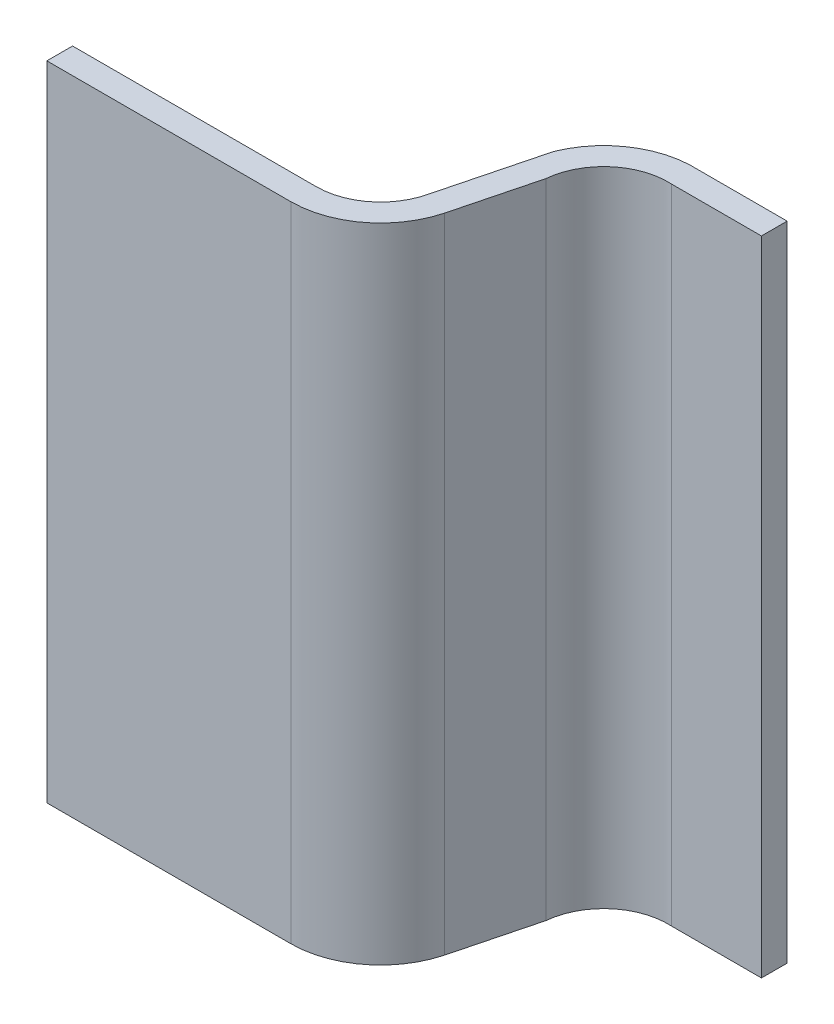
ISO-10303-21;
HEADER;
FILE_DESCRIPTION(('STEP AP214'),'2;1');
FILE_NAME('part.step','',(''),(''),'','','');
FILE_SCHEMA(('AUTOMOTIVE_DESIGN { 1 0 10303 214 1 1 1 1 }'));
ENDSEC;
DATA;
#1=APPLICATION_CONTEXT('core data for automotive mechanical design processes');
#2=APPLICATION_PROTOCOL_DEFINITION('international standard','automotive_design',2000,#1);
#3=PRODUCT_CONTEXT('',#1,'mechanical');
#4=PRODUCT('Part','Part','',(#3));
#5=PRODUCT_RELATED_PRODUCT_CATEGORY('part','',(#4));
#6=PRODUCT_DEFINITION_FORMATION('','',#4);
#7=PRODUCT_DEFINITION_CONTEXT('part definition',#1,'design');
#8=PRODUCT_DEFINITION('design','',#6,#7);
#9=PRODUCT_DEFINITION_SHAPE('','',#8);
#10=(LENGTH_UNIT() NAMED_UNIT(*) SI_UNIT(.MILLI.,.METRE.));
#11=(NAMED_UNIT(*) PLANE_ANGLE_UNIT() SI_UNIT($,.RADIAN.));
#12=(NAMED_UNIT(*) SI_UNIT($,.STERADIAN.) SOLID_ANGLE_UNIT());
#13=UNCERTAINTY_MEASURE_WITH_UNIT(LENGTH_MEASURE(1.E-05),#10,'distance_accuracy_value','');
#14=(GEOMETRIC_REPRESENTATION_CONTEXT(3) GLOBAL_UNCERTAINTY_ASSIGNED_CONTEXT((#13)) GLOBAL_UNIT_ASSIGNED_CONTEXT((#10,
#11,#12)) REPRESENTATION_CONTEXT('',''));
#15=CARTESIAN_POINT('',(0.,0.,0.));
#16=DIRECTION('',(0.,0.,1.));
#17=DIRECTION('',(1.,0.,0.));
#18=AXIS2_PLACEMENT_3D('',#15,#16,#17);
#19=CARTESIAN_POINT('',(1.378902855275,-0.5,-0.06199204735314));
#20=DIRECTION('',(0.,1.,0.));
#21=DIRECTION('',(1.,0.,0.));
#22=AXIS2_PLACEMENT_3D('',#19,#20,#21);
#23=PLANE('',#22);
#24=DIRECTION('',(1.,0.,0.));
#25=VECTOR('',#24,1.);
#26=CARTESIAN_POINT('',(1.169977321628,-0.5,0.009740751764453));
#27=LINE('',#26,#25);
#28=CARTESIAN_POINT('',(1.169977321628,-0.5,0.009740751764453));
#29=VERTEX_POINT('',#28);
#30=CARTESIAN_POINT('',(1.359788421337,-0.5,0.009740751764453));
#31=VERTEX_POINT('',#30);
#32=EDGE_CURVE('E156',#29,#31,#27,.T.);
#33=ORIENTED_EDGE('',*,*,#32,.F.);
#34=DIRECTION('',(0.,0.,-1.));
#35=VECTOR('',#34,1.);
#36=CARTESIAN_POINT('',(1.169977321628,-0.5,0.009740751764453));
#37=LINE('',#36,#35);
#38=CARTESIAN_POINT('',(1.169977321628,-0.5,-0.01025924823555));
#39=VERTEX_POINT('',#38);
#40=EDGE_CURVE('E11',#29,#39,#37,.T.);
#41=ORIENTED_EDGE('',*,*,#40,.T.);
#42=DIRECTION('',(1.,0.,0.));
#43=VECTOR('',#42,1.);
#44=CARTESIAN_POINT('',(1.169977321628,-0.5,-0.01025924823555));
#45=LINE('',#44,#43);
#46=CARTESIAN_POINT('',(1.35975955473,-0.5,-0.01025924823555));
#47=VERTEX_POINT('',#46);
#48=EDGE_CURVE('E142',#39,#47,#45,.T.);
#49=ORIENTED_EDGE('',*,*,#48,.T.);
#50=CARTESIAN_POINT('',(1.359602,-0.5,-0.060259));
#51=DIRECTION('',(0.,-1.,0.));
#52=DIRECTION('',(1.,0.,0.));
#53=AXIS2_PLACEMENT_3D('',#50,#51,#52);
#54=CIRCLE('',#53,0.05);
#55=CARTESIAN_POINT('',(1.408509050491,-0.5,-0.04986186518901));
#56=VERTEX_POINT('',#55);
#57=EDGE_CURVE('E253',#56,#47,#54,.T.);
#58=ORIENTED_EDGE('',*,*,#57,.F.);
#59=DIRECTION('',(-0.249583750256063,0.,0.968353216346246));
#60=VECTOR('',#59,1.);
#61=CARTESIAN_POINT('',(1.428216042267,-0.5,-0.12632248753));
#62=LINE('',#61,#60);
#63=CARTESIAN_POINT('',(1.428216042267,-0.5,-0.12632248753));
#64=VERTEX_POINT('',#63);
#65=EDGE_CURVE('E214',#64,#56,#62,.T.);
#66=ORIENTED_EDGE('',*,*,#65,.F.);
#67=CARTESIAN_POINT('',(1.493212981984,-0.5,-0.100334070352));
#68=DIRECTION('',(0.,-1.,0.));
#69=DIRECTION('',(1.,0.,0.));
#70=AXIS2_PLACEMENT_3D('',#67,#68,#69);
#71=CIRCLE('',#70,0.07);
#72=CARTESIAN_POINT('',(1.489977321628,-0.5,-0.170259248236));
#73=VERTEX_POINT('',#72);
#74=EDGE_CURVE('E219',#64,#73,#71,.T.);
#75=ORIENTED_EDGE('',*,*,#74,.T.);
#76=DIRECTION('',(-1.,0.,0.));
#77=VECTOR('',#76,1.);
#78=CARTESIAN_POINT('',(1.565947321628,-0.5,-0.170259248236));
#79=LINE('',#78,#77);
#80=CARTESIAN_POINT('',(1.565947321628,-0.5,-0.170259248236));
#81=VERTEX_POINT('',#80);
#82=EDGE_CURVE('E179',#81,#73,#79,.T.);
#83=ORIENTED_EDGE('',*,*,#82,.F.);
#84=DIRECTION('',(0.,0.,-1.));
#85=VECTOR('',#84,1.);
#86=CARTESIAN_POINT('',(1.565947321628,-0.5,-0.150259248236));
#87=LINE('',#86,#85);
#88=CARTESIAN_POINT('',(1.565947321628,-0.5,-0.150259248236));
#89=VERTEX_POINT('',#88);
#90=EDGE_CURVE('E210',#89,#81,#87,.T.);
#91=ORIENTED_EDGE('',*,*,#90,.F.);
#92=DIRECTION('',(1.,0.,0.));
#93=VECTOR('',#92,1.);
#94=CARTESIAN_POINT('',(1.495947321628,-0.5,-0.150259248236));
#95=LINE('',#94,#93);
#96=CARTESIAN_POINT('',(1.495947321628,-0.5,-0.150259248236));
#97=VERTEX_POINT('',#96);
#98=EDGE_CURVE('E169',#97,#89,#95,.T.);
#99=ORIENTED_EDGE('',*,*,#98,.F.);
#100=CARTESIAN_POINT('',(1.493212981984,-0.5,-0.100334070352));
#101=DIRECTION('',(0.,-1.,0.));
#102=DIRECTION('',(1.,0.,0.));
#103=AXIS2_PLACEMENT_3D('',#100,#101,#102);
#104=CIRCLE('',#103,0.05);
#105=CARTESIAN_POINT('',(1.443437393356,-0.5,-0.105065959694));
#106=VERTEX_POINT('',#105);
#107=EDGE_CURVE('E197',#106,#97,#104,.T.);
#108=ORIENTED_EDGE('',*,*,#107,.F.);
#109=DIRECTION('',(0.249583750256063,0.,-0.968353216346246));
#110=VECTOR('',#109,1.);
#111=CARTESIAN_POINT('',(1.427301564852,-0.5,-0.04246099677479));
#112=LINE('',#111,#110);
#113=CARTESIAN_POINT('',(1.427301564852,-0.5,-0.04246099677479));
#114=VERTEX_POINT('',#113);
#115=EDGE_CURVE('E193',#114,#106,#112,.T.);
#116=ORIENTED_EDGE('',*,*,#115,.F.);
#117=CARTESIAN_POINT('',(1.359602,-0.5,-0.060259));
#118=DIRECTION('',(0.,-1.,0.));
#119=DIRECTION('',(1.,0.,0.));
#120=AXIS2_PLACEMENT_3D('',#117,#118,#119);
#121=CIRCLE('',#120,0.07);
#122=EDGE_CURVE('E186',#114,#31,#121,.T.);
#123=ORIENTED_EDGE('',*,*,#122,.T.);
#124=EDGE_LOOP('',(#33,#41,#49,#58,#66,#75,#83,#91,#99,#108,#116,#123));
#125=FACE_BOUND('',#124,.T.);
#126=ADVANCED_FACE('F17',(#125),#23,.F.);
#127=CARTESIAN_POINT('',(1.378902855275,0.,-0.06199204735314));
#128=DIRECTION('',(0.,1.,0.));
#129=DIRECTION('',(1.,0.,0.));
#130=AXIS2_PLACEMENT_3D('',#127,#128,#129);
#131=PLANE('',#130);
#132=DIRECTION('',(1.,0.,0.));
#133=VECTOR('',#132,1.);
#134=CARTESIAN_POINT('',(1.169977321628,0.,0.009740751764453));
#135=LINE('',#134,#133);
#136=CARTESIAN_POINT('',(1.169977321628,0.,0.009740751764453));
#137=VERTEX_POINT('',#136);
#138=CARTESIAN_POINT('',(1.359788421337,0.,0.009740751764453));
#139=VERTEX_POINT('',#138);
#140=EDGE_CURVE('E136',#137,#139,#135,.T.);
#141=ORIENTED_EDGE('',*,*,#140,.T.);
#142=CARTESIAN_POINT('',(1.359602,0.,-0.060259));
#143=DIRECTION('',(0.,-1.,0.));
#144=DIRECTION('',(1.,0.,0.));
#145=AXIS2_PLACEMENT_3D('',#142,#143,#144);
#146=CIRCLE('',#145,0.07);
#147=CARTESIAN_POINT('',(1.427301564852,0.,-0.04246099677479));
#148=VERTEX_POINT('',#147);
#149=EDGE_CURVE('E182',#148,#139,#146,.T.);
#150=ORIENTED_EDGE('',*,*,#149,.F.);
#151=DIRECTION('',(0.249583750256063,0.,-0.968353216346246));
#152=VECTOR('',#151,1.);
#153=CARTESIAN_POINT('',(1.427301564852,0.,-0.04246099677479));
#154=LINE('',#153,#152);
#155=CARTESIAN_POINT('',(1.443437393356,0.,-0.105065959694));
#156=VERTEX_POINT('',#155);
#157=EDGE_CURVE('E202',#148,#156,#154,.T.);
#158=ORIENTED_EDGE('',*,*,#157,.T.);
#159=CARTESIAN_POINT('',(1.493212981984,0.,-0.100334070352));
#160=DIRECTION('',(0.,-1.,0.));
#161=DIRECTION('',(1.,0.,0.));
#162=AXIS2_PLACEMENT_3D('',#159,#160,#161);
#163=CIRCLE('',#162,0.05);
#164=CARTESIAN_POINT('',(1.495947321628,0.,-0.150259248236));
#165=VERTEX_POINT('',#164);
#166=EDGE_CURVE('E165',#156,#165,#163,.T.);
#167=ORIENTED_EDGE('',*,*,#166,.T.);
#168=DIRECTION('',(1.,0.,0.));
#169=VECTOR('',#168,1.);
#170=CARTESIAN_POINT('',(1.495947321628,0.,-0.150259248236));
#171=LINE('',#170,#169);
#172=CARTESIAN_POINT('',(1.565947321628,0.,-0.150259248236));
#173=VERTEX_POINT('',#172);
#174=EDGE_CURVE('E206',#165,#173,#171,.T.);
#175=ORIENTED_EDGE('',*,*,#174,.T.);
#176=DIRECTION('',(0.,0.,-1.));
#177=VECTOR('',#176,1.);
#178=CARTESIAN_POINT('',(1.565947321628,0.,-0.150259248236));
#179=LINE('',#178,#177);
#180=CARTESIAN_POINT('',(1.565947321628,0.,-0.170259248236));
#181=VERTEX_POINT('',#180);
#182=EDGE_CURVE('E230',#173,#181,#179,.T.);
#183=ORIENTED_EDGE('',*,*,#182,.T.);
#184=DIRECTION('',(-1.,0.,0.));
#185=VECTOR('',#184,1.);
#186=CARTESIAN_POINT('',(1.565947321628,0.,-0.170259248236));
#187=LINE('',#186,#185);
#188=CARTESIAN_POINT('',(1.489977321628,0.,-0.170259248236));
#189=VERTEX_POINT('',#188);
#190=EDGE_CURVE('E178',#181,#189,#187,.T.);
#191=ORIENTED_EDGE('',*,*,#190,.T.);
#192=CARTESIAN_POINT('',(1.493212981984,0.,-0.100334070352));
#193=DIRECTION('',(0.,-1.,0.));
#194=DIRECTION('',(1.,0.,0.));
#195=AXIS2_PLACEMENT_3D('',#192,#193,#194);
#196=CIRCLE('',#195,0.07);
#197=CARTESIAN_POINT('',(1.428216042267,0.,-0.12632248753));
#198=VERTEX_POINT('',#197);
#199=EDGE_CURVE('E244',#198,#189,#196,.T.);
#200=ORIENTED_EDGE('',*,*,#199,.F.);
#201=DIRECTION('',(-0.249583750256063,0.,0.968353216346246));
#202=VECTOR('',#201,1.);
#203=CARTESIAN_POINT('',(1.428216042267,0.,-0.12632248753));
#204=LINE('',#203,#202);
#205=CARTESIAN_POINT('',(1.408509050491,0.,-0.04986186518901));
#206=VERTEX_POINT('',#205);
#207=EDGE_CURVE('E252',#198,#206,#204,.T.);
#208=ORIENTED_EDGE('',*,*,#207,.T.);
#209=CARTESIAN_POINT('',(1.359602,0.,-0.060259));
#210=DIRECTION('',(0.,-1.,0.));
#211=DIRECTION('',(1.,0.,0.));
#212=AXIS2_PLACEMENT_3D('',#209,#210,#211);
#213=CIRCLE('',#212,0.05);
#214=CARTESIAN_POINT('',(1.35975955473,0.,-0.01025924823555));
#215=VERTEX_POINT('',#214);
#216=EDGE_CURVE('E261',#206,#215,#213,.T.);
#217=ORIENTED_EDGE('',*,*,#216,.T.);
#218=DIRECTION('',(1.,0.,0.));
#219=VECTOR('',#218,1.);
#220=CARTESIAN_POINT('',(1.169977321628,0.,-0.01025924823555));
#221=LINE('',#220,#219);
#222=CARTESIAN_POINT('',(1.169977321628,0.,-0.01025924823555));
#223=VERTEX_POINT('',#222);
#224=EDGE_CURVE('E139',#223,#215,#221,.T.);
#225=ORIENTED_EDGE('',*,*,#224,.F.);
#226=DIRECTION('',(0.,0.,-1.));
#227=VECTOR('',#226,1.);
#228=CARTESIAN_POINT('',(1.169977321628,0.,0.009740751764453));
#229=LINE('',#228,#227);
#230=EDGE_CURVE('E26',#137,#223,#229,.T.);
#231=ORIENTED_EDGE('',*,*,#230,.F.);
#232=EDGE_LOOP('',(#141,#150,#158,#167,#175,#183,#191,#200,#208,#217,#225,#231));
#233=FACE_BOUND('',#232,.T.);
#234=ADVANCED_FACE('F19',(#233),#131,.T.);
#235=CARTESIAN_POINT('',(1.169977321628,0.,0.009740751764453));
#236=DIRECTION('',(1.,0.,0.));
#237=DIRECTION('',(0.,1.,0.));
#238=AXIS2_PLACEMENT_3D('',#235,#236,#237);
#239=PLANE('',#238);
#240=DIRECTION('',(0.,-1.,0.));
#241=VECTOR('',#240,1.);
#242=CARTESIAN_POINT('',(1.169977321628,0.,0.009740751764453));
#243=LINE('',#242,#241);
#244=EDGE_CURVE('E148',#137,#29,#243,.T.);
#245=ORIENTED_EDGE('',*,*,#244,.F.);
#246=ORIENTED_EDGE('',*,*,#230,.T.);
#247=DIRECTION('',(0.,-1.,0.));
#248=VECTOR('',#247,1.);
#249=CARTESIAN_POINT('',(1.169977321628,0.,-0.01025924823555));
#250=LINE('',#249,#248);
#251=EDGE_CURVE('E173',#223,#39,#250,.T.);
#252=ORIENTED_EDGE('',*,*,#251,.T.);
#253=ORIENTED_EDGE('',*,*,#40,.F.);
#254=EDGE_LOOP('',(#245,#246,#252,#253));
#255=FACE_BOUND('',#254,.T.);
#256=ADVANCED_FACE('F154',(#255),#239,.F.);
#257=CARTESIAN_POINT('',(1.169977321628,0.,-0.01025924823555));
#258=DIRECTION('',(0.,0.,1.));
#259=DIRECTION('',(0.,-1.,0.));
#260=AXIS2_PLACEMENT_3D('',#257,#258,#259);
#261=PLANE('',#260);
#262=ORIENTED_EDGE('',*,*,#251,.F.);
#263=ORIENTED_EDGE('',*,*,#224,.T.);
#264=DIRECTION('',(0.,-1.,0.));
#265=VECTOR('',#264,1.);
#266=CARTESIAN_POINT('',(1.35975955473,0.,-0.01025924823555));
#267=LINE('',#266,#265);
#268=EDGE_CURVE('E257',#215,#47,#267,.T.);
#269=ORIENTED_EDGE('',*,*,#268,.T.);
#270=ORIENTED_EDGE('',*,*,#48,.F.);
#271=EDGE_LOOP('',(#262,#263,#269,#270));
#272=FACE_BOUND('',#271,.T.);
#273=ADVANCED_FACE('F269',(#272),#261,.F.);
#274=CARTESIAN_POINT('',(1.359602,0.,-0.060259));
#275=DIRECTION('',(0.,1.,0.));
#276=DIRECTION('',(1.,0.,0.));
#277=AXIS2_PLACEMENT_3D('',#274,#275,#276);
#278=CYLINDRICAL_SURFACE('',#277,0.05);
#279=DIRECTION('',(0.,-1.,0.));
#280=VECTOR('',#279,1.);
#281=CARTESIAN_POINT('',(1.408509050491,0.,-0.04986186518901));
#282=LINE('',#281,#280);
#283=EDGE_CURVE('E218',#206,#56,#282,.T.);
#284=ORIENTED_EDGE('',*,*,#283,.T.);
#285=ORIENTED_EDGE('',*,*,#57,.T.);
#286=ORIENTED_EDGE('',*,*,#268,.F.);
#287=ORIENTED_EDGE('',*,*,#216,.F.);
#288=EDGE_LOOP('',(#284,#285,#286,#287));
#289=FACE_BOUND('',#288,.T.);
#290=ADVANCED_FACE('F271',(#289),#278,.F.);
#291=CARTESIAN_POINT('',(1.428216042267,0.,-0.12632248753));
#292=DIRECTION('',(-0.968353216346246,0.,-0.249583750256063));
#293=DIRECTION('',(-0.249583750256063,0.,0.968353216346246));
#294=AXIS2_PLACEMENT_3D('',#291,#292,#293);
#295=PLANE('',#294);
#296=DIRECTION('',(0.,-1.,0.));
#297=VECTOR('',#296,1.);
#298=CARTESIAN_POINT('',(1.428216042267,0.,-0.12632248753));
#299=LINE('',#298,#297);
#300=EDGE_CURVE('E240',#198,#64,#299,.T.);
#301=ORIENTED_EDGE('',*,*,#300,.T.);
#302=ORIENTED_EDGE('',*,*,#65,.T.);
#303=ORIENTED_EDGE('',*,*,#283,.F.);
#304=ORIENTED_EDGE('',*,*,#207,.F.);
#305=EDGE_LOOP('',(#301,#302,#303,#304));
#306=FACE_BOUND('',#305,.T.);
#307=ADVANCED_FACE('F275',(#306),#295,.T.);
#308=CARTESIAN_POINT('',(1.493212981984,0.,-0.100334070352));
#309=DIRECTION('',(0.,1.,0.));
#310=DIRECTION('',(1.,0.,0.));
#311=AXIS2_PLACEMENT_3D('',#308,#309,#310);
#312=CYLINDRICAL_SURFACE('',#311,0.07);
#313=ORIENTED_EDGE('',*,*,#300,.F.);
#314=ORIENTED_EDGE('',*,*,#199,.T.);
#315=DIRECTION('',(0.,-1.,0.));
#316=VECTOR('',#315,1.);
#317=CARTESIAN_POINT('',(1.489977321628,0.,-0.170259248236));
#318=LINE('',#317,#316);
#319=EDGE_CURVE('E174',#189,#73,#318,.T.);
#320=ORIENTED_EDGE('',*,*,#319,.T.);
#321=ORIENTED_EDGE('',*,*,#74,.F.);
#322=EDGE_LOOP('',(#313,#314,#320,#321));
#323=FACE_BOUND('',#322,.T.);
#324=ADVANCED_FACE('F279',(#323),#312,.T.);
#325=CARTESIAN_POINT('',(1.565947321628,0.,-0.170259248236));
#326=DIRECTION('',(0.,0.,-1.));
#327=DIRECTION('',(0.,-1.,0.));
#328=AXIS2_PLACEMENT_3D('',#325,#326,#327);
#329=PLANE('',#328);
#330=DIRECTION('',(0.,-1.,0.));
#331=VECTOR('',#330,1.);
#332=CARTESIAN_POINT('',(1.565947321628,0.,-0.170259248236));
#333=LINE('',#332,#331);
#334=EDGE_CURVE('E226',#181,#81,#333,.T.);
#335=ORIENTED_EDGE('',*,*,#334,.T.);
#336=ORIENTED_EDGE('',*,*,#82,.T.);
#337=ORIENTED_EDGE('',*,*,#319,.F.);
#338=ORIENTED_EDGE('',*,*,#190,.F.);
#339=EDGE_LOOP('',(#335,#336,#337,#338));
#340=FACE_BOUND('',#339,.T.);
#341=ADVANCED_FACE('F283',(#340),#329,.T.);
#342=CARTESIAN_POINT('',(1.565947321628,0.,-0.150259248236));
#343=DIRECTION('',(1.,0.,0.));
#344=DIRECTION('',(0.,1.,0.));
#345=AXIS2_PLACEMENT_3D('',#342,#343,#344);
#346=PLANE('',#345);
#347=DIRECTION('',(0.,-1.,0.));
#348=VECTOR('',#347,1.);
#349=CARTESIAN_POINT('',(1.565947321628,0.,-0.150259248236));
#350=LINE('',#349,#348);
#351=EDGE_CURVE('E190',#173,#89,#350,.T.);
#352=ORIENTED_EDGE('',*,*,#351,.T.);
#353=ORIENTED_EDGE('',*,*,#90,.T.);
#354=ORIENTED_EDGE('',*,*,#334,.F.);
#355=ORIENTED_EDGE('',*,*,#182,.F.);
#356=EDGE_LOOP('',(#352,#353,#354,#355));
#357=FACE_BOUND('',#356,.T.);
#358=ADVANCED_FACE('F287',(#357),#346,.T.);
#359=CARTESIAN_POINT('',(1.495947321628,0.,-0.150259248236));
#360=DIRECTION('',(0.,0.,1.));
#361=DIRECTION('',(0.,-1.,0.));
#362=AXIS2_PLACEMENT_3D('',#359,#360,#361);
#363=PLANE('',#362);
#364=DIRECTION('',(0.,-1.,0.));
#365=VECTOR('',#364,1.);
#366=CARTESIAN_POINT('',(1.495947321628,0.,-0.150259248236));
#367=LINE('',#366,#365);
#368=EDGE_CURVE('E170',#165,#97,#367,.T.);
#369=ORIENTED_EDGE('',*,*,#368,.T.);
#370=ORIENTED_EDGE('',*,*,#98,.T.);
#371=ORIENTED_EDGE('',*,*,#351,.F.);
#372=ORIENTED_EDGE('',*,*,#174,.F.);
#373=EDGE_LOOP('',(#369,#370,#371,#372));
#374=FACE_BOUND('',#373,.T.);
#375=ADVANCED_FACE('F289',(#374),#363,.T.);
#376=CARTESIAN_POINT('',(1.493212981984,0.,-0.100334070352));
#377=DIRECTION('',(0.,1.,0.));
#378=DIRECTION('',(1.,0.,0.));
#379=AXIS2_PLACEMENT_3D('',#376,#377,#378);
#380=CYLINDRICAL_SURFACE('',#379,0.05);
#381=DIRECTION('',(0.,-1.,0.));
#382=VECTOR('',#381,1.);
#383=CARTESIAN_POINT('',(1.443437393356,0.,-0.105065959694));
#384=LINE('',#383,#382);
#385=EDGE_CURVE('E198',#156,#106,#384,.T.);
#386=ORIENTED_EDGE('',*,*,#385,.T.);
#387=ORIENTED_EDGE('',*,*,#107,.T.);
#388=ORIENTED_EDGE('',*,*,#368,.F.);
#389=ORIENTED_EDGE('',*,*,#166,.F.);
#390=EDGE_LOOP('',(#386,#387,#388,#389));
#391=FACE_BOUND('',#390,.T.);
#392=ADVANCED_FACE('F292',(#391),#380,.F.);
#393=CARTESIAN_POINT('',(1.427301564852,0.,-0.04246099677479));
#394=DIRECTION('',(0.968353216346246,0.,0.249583750256063));
#395=DIRECTION('',(0.,-1.,0.));
#396=AXIS2_PLACEMENT_3D('',#393,#394,#395);
#397=PLANE('',#396);
#398=DIRECTION('',(0.,-1.,0.));
#399=VECTOR('',#398,1.);
#400=CARTESIAN_POINT('',(1.427301564852,0.,-0.04246099677479));
#401=LINE('',#400,#399);
#402=EDGE_CURVE('E152',#148,#114,#401,.T.);
#403=ORIENTED_EDGE('',*,*,#402,.T.);
#404=ORIENTED_EDGE('',*,*,#115,.T.);
#405=ORIENTED_EDGE('',*,*,#385,.F.);
#406=ORIENTED_EDGE('',*,*,#157,.F.);
#407=EDGE_LOOP('',(#403,#404,#405,#406));
#408=FACE_BOUND('',#407,.T.);
#409=ADVANCED_FACE('F302',(#408),#397,.T.);
#410=CARTESIAN_POINT('',(1.359602,0.,-0.060259));
#411=DIRECTION('',(0.,1.,0.));
#412=DIRECTION('',(1.,0.,0.));
#413=AXIS2_PLACEMENT_3D('',#410,#411,#412);
#414=CYLINDRICAL_SURFACE('',#413,0.07);
#415=ORIENTED_EDGE('',*,*,#402,.F.);
#416=ORIENTED_EDGE('',*,*,#149,.T.);
#417=DIRECTION('',(0.,-1.,0.));
#418=VECTOR('',#417,1.);
#419=CARTESIAN_POINT('',(1.359788421337,0.,0.009740751764453));
#420=LINE('',#419,#418);
#421=EDGE_CURVE('E150',#139,#31,#420,.T.);
#422=ORIENTED_EDGE('',*,*,#421,.T.);
#423=ORIENTED_EDGE('',*,*,#122,.F.);
#424=EDGE_LOOP('',(#415,#416,#422,#423));
#425=FACE_BOUND('',#424,.T.);
#426=ADVANCED_FACE('F301',(#425),#414,.T.);
#427=CARTESIAN_POINT('',(1.169977321628,0.,0.009740751764453));
#428=DIRECTION('',(0.,0.,1.));
#429=DIRECTION('',(0.,-1.,0.));
#430=AXIS2_PLACEMENT_3D('',#427,#428,#429);
#431=PLANE('',#430);
#432=ORIENTED_EDGE('',*,*,#244,.T.);
#433=ORIENTED_EDGE('',*,*,#32,.T.);
#434=ORIENTED_EDGE('',*,*,#421,.F.);
#435=ORIENTED_EDGE('',*,*,#140,.F.);
#436=EDGE_LOOP('',(#432,#433,#434,#435));
#437=FACE_BOUND('',#436,.T.);
#438=ADVANCED_FACE('F146',(#437),#431,.T.);
#439=CLOSED_SHELL('',(#126,#234,#256,#273,#290,#307,#324,#341,#358,#375,#392,#409,#426,#438));
#440=MANIFOLD_SOLID_BREP('B1',#439);
#441=ADVANCED_BREP_SHAPE_REPRESENTATION('',(#18,#440),#14);
#442=SHAPE_DEFINITION_REPRESENTATION(#9,#441);
ENDSEC;
END-ISO-10303-21;
